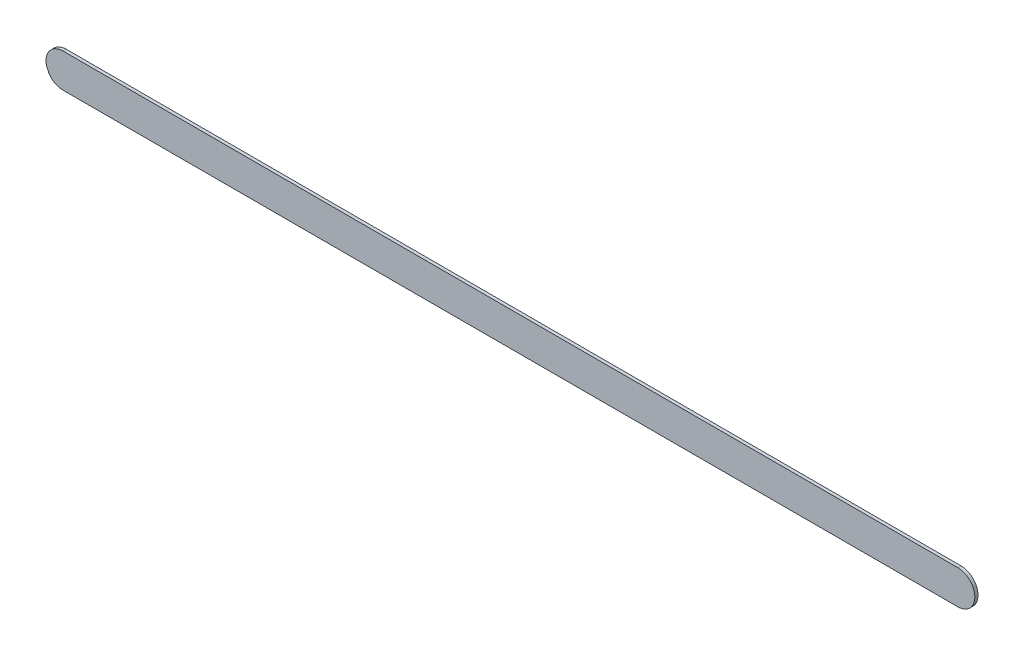
ISO-10303-21;
HEADER;
FILE_DESCRIPTION(('STEP AP214'),'2;1');
FILE_NAME('part.step','',(''),(''),'','','');
FILE_SCHEMA(('AUTOMOTIVE_DESIGN { 1 0 10303 214 1 1 1 1 }'));
ENDSEC;
DATA;
#1=APPLICATION_CONTEXT('core data for automotive mechanical design processes');
#2=APPLICATION_PROTOCOL_DEFINITION('international standard','automotive_design',2000,#1);
#3=PRODUCT_CONTEXT('',#1,'mechanical');
#4=PRODUCT('Part','Part','',(#3));
#5=PRODUCT_RELATED_PRODUCT_CATEGORY('part','',(#4));
#6=PRODUCT_DEFINITION_FORMATION('','',#4);
#7=PRODUCT_DEFINITION_CONTEXT('part definition',#1,'design');
#8=PRODUCT_DEFINITION('design','',#6,#7);
#9=PRODUCT_DEFINITION_SHAPE('','',#8);
#10=(LENGTH_UNIT() NAMED_UNIT(*) SI_UNIT(.MILLI.,.METRE.));
#11=(NAMED_UNIT(*) PLANE_ANGLE_UNIT() SI_UNIT($,.RADIAN.));
#12=(NAMED_UNIT(*) SI_UNIT($,.STERADIAN.) SOLID_ANGLE_UNIT());
#13=UNCERTAINTY_MEASURE_WITH_UNIT(LENGTH_MEASURE(1.E-05),#10,'distance_accuracy_value','');
#14=(GEOMETRIC_REPRESENTATION_CONTEXT(3) GLOBAL_UNCERTAINTY_ASSIGNED_CONTEXT((#13)) GLOBAL_UNIT_ASSIGNED_CONTEXT((#10,
#11,#12)) REPRESENTATION_CONTEXT('',''));
#15=CARTESIAN_POINT('',(0.,0.,0.));
#16=DIRECTION('',(0.,0.,1.));
#17=DIRECTION('',(1.,0.,0.));
#18=AXIS2_PLACEMENT_3D('',#15,#16,#17);
#19=CARTESIAN_POINT('',(6.16503974,11.303,0.));
#20=DIRECTION('',(0.,0.,-1.));
#21=DIRECTION('',(0.,1.,0.));
#22=AXIS2_PLACEMENT_3D('',#19,#20,#21);
#23=CYLINDRICAL_SURFACE('',#22,0.1905);
#24=CARTESIAN_POINT('',(6.16503974,11.303,0.03556));
#25=DIRECTION('',(0.,0.,1.));
#26=DIRECTION('',(0.,1.,0.));
#27=AXIS2_PLACEMENT_3D('',#24,#25,#26);
#28=CIRCLE('',#27,0.1905);
#29=CARTESIAN_POINT('',(6.007553669661,11.195816103592,0.03556));
#30=VERTEX_POINT('',#29);
#31=CARTESIAN_POINT('',(6.16503974,11.1125,0.03556));
#32=VERTEX_POINT('',#31);
#33=EDGE_CURVE('E11',#30,#32,#28,.T.);
#34=ORIENTED_EDGE('',*,*,#33,.F.);
#35=DIRECTION('',(0.,0.,1.));
#36=VECTOR('',#35,1.);
#37=CARTESIAN_POINT('',(6.007553669661,11.195816103592,0.));
#38=LINE('',#37,#36);
#39=CARTESIAN_POINT('',(6.007553669661,11.195816103592,0.));
#40=VERTEX_POINT('',#39);
#41=EDGE_CURVE('E23',#40,#30,#38,.T.);
#42=ORIENTED_EDGE('',*,*,#41,.F.);
#43=CARTESIAN_POINT('',(6.16503974,11.303,0.));
#44=DIRECTION('',(0.,0.,1.));
#45=DIRECTION('',(0.,1.,0.));
#46=AXIS2_PLACEMENT_3D('',#43,#44,#45);
#47=CIRCLE('',#46,0.1905);
#48=CARTESIAN_POINT('',(6.16503974,11.1125,0.));
#49=VERTEX_POINT('',#48);
#50=EDGE_CURVE('E114',#40,#49,#47,.T.);
#51=ORIENTED_EDGE('',*,*,#50,.T.);
#52=DIRECTION('',(0.,0.,1.));
#53=VECTOR('',#52,1.);
#54=CARTESIAN_POINT('',(6.16503974,11.1125,0.));
#55=LINE('',#54,#53);
#56=EDGE_CURVE('E36',#49,#32,#55,.T.);
#57=ORIENTED_EDGE('',*,*,#56,.T.);
#58=EDGE_LOOP('',(#34,#42,#51,#57));
#59=FACE_BOUND('',#58,.T.);
#60=ADVANCED_FACE('F16',(#59),#23,.T.);
#61=CARTESIAN_POINT('',(5.588,11.049,0.));
#62=DIRECTION('',(0.,0.,-1.));
#63=DIRECTION('',(1.,0.,0.));
#64=AXIS2_PLACEMENT_3D('',#61,#62,#63);
#65=CYLINDRICAL_SURFACE('',#64,0.4445);
#66=ORIENTED_EDGE('',*,*,#41,.T.);
#67=CARTESIAN_POINT('',(5.588,11.049,0.03556));
#68=DIRECTION('',(0.,0.,1.));
#69=DIRECTION('',(1.,0.,0.));
#70=AXIS2_PLACEMENT_3D('',#67,#68,#69);
#71=CIRCLE('',#70,0.4445);
#72=CARTESIAN_POINT('',(5.9796316788799,11.2592495614685,0.03556));
#73=VERTEX_POINT('',#72);
#74=EDGE_CURVE('E111',#30,#73,#71,.T.);
#75=ORIENTED_EDGE('',*,*,#74,.T.);
#76=DIRECTION('',(0.,0.,1.));
#77=VECTOR('',#76,1.);
#78=CARTESIAN_POINT('',(5.9796316788799,11.2592495614685,0.));
#79=LINE('',#78,#77);
#80=CARTESIAN_POINT('',(5.9796316788799,11.2592495614685,0.));
#81=VERTEX_POINT('',#80);
#82=EDGE_CURVE('E109',#81,#73,#79,.T.);
#83=ORIENTED_EDGE('',*,*,#82,.F.);
#84=CARTESIAN_POINT('',(5.588,11.049,0.));
#85=DIRECTION('',(0.,0.,1.));
#86=DIRECTION('',(1.,0.,0.));
#87=AXIS2_PLACEMENT_3D('',#84,#85,#86);
#88=CIRCLE('',#87,0.4445);
#89=EDGE_CURVE('E106',#40,#81,#88,.T.);
#90=ORIENTED_EDGE('',*,*,#89,.F.);
#91=EDGE_LOOP('',(#66,#75,#83,#90));
#92=FACE_BOUND('',#91,.T.);
#93=ADVANCED_FACE('F125',(#92),#65,.F.);
#94=CARTESIAN_POINT('',(6.16503974,11.303,0.));
#95=DIRECTION('',(0.,0.,-1.));
#96=DIRECTION('',(0.,1.,0.));
#97=AXIS2_PLACEMENT_3D('',#94,#95,#96);
#98=CYLINDRICAL_SURFACE('',#97,0.1905);
#99=CARTESIAN_POINT('',(6.16503974,11.303,0.03556));
#100=DIRECTION('',(0.,0.,1.));
#101=DIRECTION('',(0.,1.,0.));
#102=AXIS2_PLACEMENT_3D('',#99,#100,#101);
#103=CIRCLE('',#102,0.1905);
#104=CARTESIAN_POINT('',(6.16503974,11.4935,0.03556));
#105=VERTEX_POINT('',#104);
#106=EDGE_CURVE('E103',#105,#73,#103,.T.);
#107=ORIENTED_EDGE('',*,*,#106,.F.);
#108=DIRECTION('',(0.,0.,1.));
#109=VECTOR('',#108,1.);
#110=CARTESIAN_POINT('',(6.16503974,11.4935,0.));
#111=LINE('',#110,#109);
#112=CARTESIAN_POINT('',(6.16503974,11.4935,0.));
#113=VERTEX_POINT('',#112);
#114=EDGE_CURVE('E101',#113,#105,#111,.T.);
#115=ORIENTED_EDGE('',*,*,#114,.F.);
#116=EDGE_CURVE('E100',#113,#81,#47,.T.);
#117=ORIENTED_EDGE('',*,*,#116,.T.);
#118=ORIENTED_EDGE('',*,*,#82,.T.);
#119=EDGE_LOOP('',(#107,#115,#117,#118));
#120=FACE_BOUND('',#119,.T.);
#121=ADVANCED_FACE('F118',(#120),#98,.T.);
#122=CARTESIAN_POINT('',(16.22050096,11.4935,0.));
#123=DIRECTION('',(0.,-1.,0.));
#124=DIRECTION('',(-1.,0.,0.));
#125=AXIS2_PLACEMENT_3D('',#122,#123,#124);
#126=PLANE('',#125);
#127=DIRECTION('',(-1.,0.,0.));
#128=VECTOR('',#127,1.);
#129=CARTESIAN_POINT('',(16.22050096,11.4935,0.03556));
#130=LINE('',#129,#128);
#131=CARTESIAN_POINT('',(16.22050096,11.4935,0.03556));
#132=VERTEX_POINT('',#131);
#133=EDGE_CURVE('E97',#132,#105,#130,.T.);
#134=ORIENTED_EDGE('',*,*,#133,.F.);
#135=DIRECTION('',(0.,0.,1.));
#136=VECTOR('',#135,1.);
#137=CARTESIAN_POINT('',(16.22050096,11.4935,0.));
#138=LINE('',#137,#136);
#139=CARTESIAN_POINT('',(16.22050096,11.4935,0.));
#140=VERTEX_POINT('',#139);
#141=EDGE_CURVE('E95',#140,#132,#138,.T.);
#142=ORIENTED_EDGE('',*,*,#141,.F.);
#143=DIRECTION('',(-1.,0.,0.));
#144=VECTOR('',#143,1.);
#145=CARTESIAN_POINT('',(16.22050096,11.4935,0.));
#146=LINE('',#145,#144);
#147=EDGE_CURVE('E86',#140,#113,#146,.T.);
#148=ORIENTED_EDGE('',*,*,#147,.T.);
#149=ORIENTED_EDGE('',*,*,#114,.T.);
#150=EDGE_LOOP('',(#134,#142,#148,#149));
#151=FACE_BOUND('',#150,.T.);
#152=ADVANCED_FACE('F121',(#151),#126,.F.);
#153=CARTESIAN_POINT('',(16.22050096,11.303,0.));
#154=DIRECTION('',(0.,0.,-1.));
#155=DIRECTION('',(0.,-1.,0.));
#156=AXIS2_PLACEMENT_3D('',#153,#154,#155);
#157=CYLINDRICAL_SURFACE('',#156,0.1905);
#158=CARTESIAN_POINT('',(16.22050096,11.303,0.03556));
#159=DIRECTION('',(0.,0.,1.));
#160=DIRECTION('',(0.,-1.,0.));
#161=AXIS2_PLACEMENT_3D('',#158,#159,#160);
#162=CIRCLE('',#161,0.1905);
#163=CARTESIAN_POINT('',(16.22050096,11.1125,0.03556));
#164=VERTEX_POINT('',#163);
#165=EDGE_CURVE('E72',#164,#132,#162,.T.);
#166=ORIENTED_EDGE('',*,*,#165,.F.);
#167=DIRECTION('',(0.,0.,1.));
#168=VECTOR('',#167,1.);
#169=CARTESIAN_POINT('',(16.22050096,11.1125,0.));
#170=LINE('',#169,#168);
#171=CARTESIAN_POINT('',(16.22050096,11.1125,0.));
#172=VERTEX_POINT('',#171);
#173=EDGE_CURVE('E67',#172,#164,#170,.T.);
#174=ORIENTED_EDGE('',*,*,#173,.F.);
#175=CARTESIAN_POINT('',(16.22050096,11.303,0.));
#176=DIRECTION('',(0.,0.,1.));
#177=DIRECTION('',(0.,-1.,0.));
#178=AXIS2_PLACEMENT_3D('',#175,#176,#177);
#179=CIRCLE('',#178,0.1905);
#180=EDGE_CURVE('E70',#172,#140,#179,.T.);
#181=ORIENTED_EDGE('',*,*,#180,.T.);
#182=ORIENTED_EDGE('',*,*,#141,.T.);
#183=EDGE_LOOP('',(#166,#174,#181,#182));
#184=FACE_BOUND('',#183,.T.);
#185=ADVANCED_FACE('F69',(#184),#157,.T.);
#186=CARTESIAN_POINT('',(6.16503974,11.1125,0.));
#187=DIRECTION('',(0.,1.,0.));
#188=DIRECTION('',(1.,0.,0.));
#189=AXIS2_PLACEMENT_3D('',#186,#187,#188);
#190=PLANE('',#189);
#191=DIRECTION('',(1.,0.,0.));
#192=VECTOR('',#191,1.);
#193=CARTESIAN_POINT('',(6.16503974,11.1125,0.03556));
#194=LINE('',#193,#192);
#195=EDGE_CURVE('E87',#32,#164,#194,.T.);
#196=ORIENTED_EDGE('',*,*,#195,.F.);
#197=ORIENTED_EDGE('',*,*,#56,.F.);
#198=DIRECTION('',(1.,0.,0.));
#199=VECTOR('',#198,1.);
#200=CARTESIAN_POINT('',(6.16503974,11.1125,0.));
#201=LINE('',#200,#199);
#202=EDGE_CURVE('E83',#49,#172,#201,.T.);
#203=ORIENTED_EDGE('',*,*,#202,.T.);
#204=ORIENTED_EDGE('',*,*,#173,.T.);
#205=EDGE_LOOP('',(#196,#197,#203,#204));
#206=FACE_BOUND('',#205,.T.);
#207=ADVANCED_FACE('F89',(#206),#190,.F.);
#208=CARTESIAN_POINT('',(11.19277035,11.303,0.));
#209=DIRECTION('',(0.,0.,1.));
#210=DIRECTION('',(1.,0.,0.));
#211=AXIS2_PLACEMENT_3D('',#208,#209,#210);
#212=PLANE('',#211);
#213=ORIENTED_EDGE('',*,*,#202,.F.);
#214=ORIENTED_EDGE('',*,*,#50,.F.);
#215=ORIENTED_EDGE('',*,*,#89,.T.);
#216=ORIENTED_EDGE('',*,*,#116,.F.);
#217=ORIENTED_EDGE('',*,*,#147,.F.);
#218=ORIENTED_EDGE('',*,*,#180,.F.);
#219=EDGE_LOOP('',(#213,#214,#215,#216,#217,#218));
#220=FACE_BOUND('',#219,.T.);
#221=ADVANCED_FACE('F81',(#220),#212,.F.);
#222=CARTESIAN_POINT('',(11.19277035,11.303,0.03556));
#223=DIRECTION('',(0.,0.,1.));
#224=DIRECTION('',(1.,0.,0.));
#225=AXIS2_PLACEMENT_3D('',#222,#223,#224);
#226=PLANE('',#225);
#227=ORIENTED_EDGE('',*,*,#33,.T.);
#228=ORIENTED_EDGE('',*,*,#195,.T.);
#229=ORIENTED_EDGE('',*,*,#165,.T.);
#230=ORIENTED_EDGE('',*,*,#133,.T.);
#231=ORIENTED_EDGE('',*,*,#106,.T.);
#232=ORIENTED_EDGE('',*,*,#74,.F.);
#233=EDGE_LOOP('',(#227,#228,#229,#230,#231,#232));
#234=FACE_BOUND('',#233,.T.);
#235=ADVANCED_FACE('F123',(#234),#226,.T.);
#236=CLOSED_SHELL('',(#60,#93,#121,#152,#185,#207,#221,#235));
#237=MANIFOLD_SOLID_BREP('B1',#236);
#238=ADVANCED_BREP_SHAPE_REPRESENTATION('',(#18,#237),#14);
#239=SHAPE_DEFINITION_REPRESENTATION(#9,#238);
ENDSEC;
END-ISO-10303-21;
